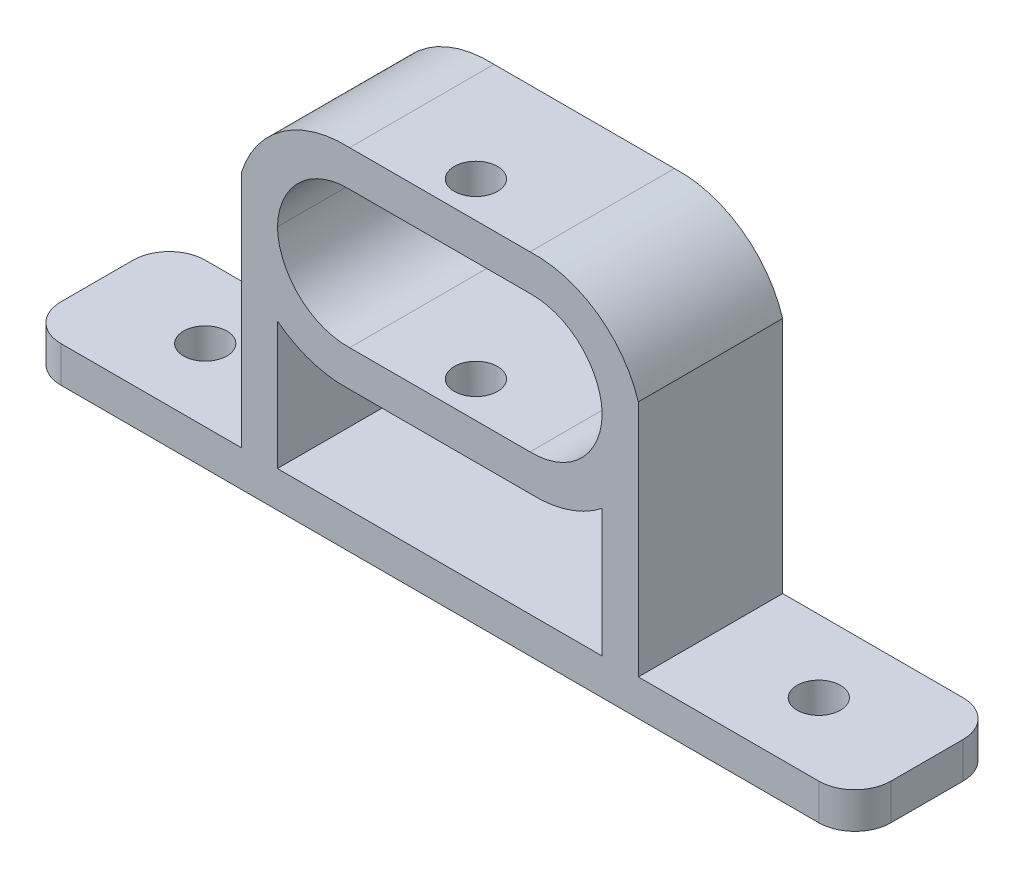
ISO-10303-21;
HEADER;
FILE_DESCRIPTION(('STEP AP214'),'2;1');
FILE_NAME('part.step','',(''),(''),'','','');
FILE_SCHEMA(('AUTOMOTIVE_DESIGN { 1 0 10303 214 1 1 1 1 }'));
ENDSEC;
DATA;
#1=APPLICATION_CONTEXT('core data for automotive mechanical design processes');
#2=APPLICATION_PROTOCOL_DEFINITION('international standard','automotive_design',2000,#1);
#3=PRODUCT_CONTEXT('',#1,'mechanical');
#4=PRODUCT('Part','Part','',(#3));
#5=PRODUCT_RELATED_PRODUCT_CATEGORY('part','',(#4));
#6=PRODUCT_DEFINITION_FORMATION('','',#4);
#7=PRODUCT_DEFINITION_CONTEXT('part definition',#1,'design');
#8=PRODUCT_DEFINITION('design','',#6,#7);
#9=PRODUCT_DEFINITION_SHAPE('','',#8);
#10=(LENGTH_UNIT() NAMED_UNIT(*) SI_UNIT(.MILLI.,.METRE.));
#11=(NAMED_UNIT(*) PLANE_ANGLE_UNIT() SI_UNIT($,.RADIAN.));
#12=(NAMED_UNIT(*) SI_UNIT($,.STERADIAN.) SOLID_ANGLE_UNIT());
#13=UNCERTAINTY_MEASURE_WITH_UNIT(LENGTH_MEASURE(1.E-05),#10,'distance_accuracy_value','');
#14=(GEOMETRIC_REPRESENTATION_CONTEXT(3) GLOBAL_UNCERTAINTY_ASSIGNED_CONTEXT((#13)) GLOBAL_UNIT_ASSIGNED_CONTEXT((#10,
#11,#12)) REPRESENTATION_CONTEXT('',''));
#15=CARTESIAN_POINT('',(0.,0.,0.));
#16=DIRECTION('',(0.,0.,1.));
#17=DIRECTION('',(1.,0.,0.));
#18=AXIS2_PLACEMENT_3D('',#15,#16,#17);
#19=CARTESIAN_POINT('',(-0.685985868036077,-5.7656940971944,20.));
#20=DIRECTION('',(0.,0.,-1.));
#21=DIRECTION('',(-1.,0.,0.));
#22=AXIS2_PLACEMENT_3D('',#19,#20,#21);
#23=PLANE('',#22);
#24=DIRECTION('',(0.,1.,0.));
#25=VECTOR('',#24,1.);
#26=CARTESIAN_POINT('',(-9.99999999999998,-35.25,20.));
#27=LINE('',#26,#25);
#28=CARTESIAN_POINT('',(-9.99999999999998,-35.25,20.));
#29=VERTEX_POINT('',#28);
#30=CARTESIAN_POINT('',(-10.,-17.5236335743977,20.));
#31=VERTEX_POINT('',#30);
#32=EDGE_CURVE('E328',#29,#31,#27,.T.);
#33=ORIENTED_EDGE('',*,*,#32,.T.);
#34=CARTESIAN_POINT('',(-0.685985868036077,-5.7656940971944,20.));
#35=DIRECTION('',(0.,0.,1.));
#36=DIRECTION('',(-1.,0.,0.));
#37=AXIS2_PLACEMENT_3D('',#34,#35,#36);
#38=CIRCLE('',#37,15.);
#39=CARTESIAN_POINT('',(0.,-20.75,20.));
#40=VERTEX_POINT('',#39);
#41=EDGE_CURVE('E257',#31,#40,#38,.T.);
#42=ORIENTED_EDGE('',*,*,#41,.T.);
#43=DIRECTION('',(1.,0.,0.));
#44=VECTOR('',#43,1.);
#45=CARTESIAN_POINT('',(0.,-20.75,20.));
#46=LINE('',#45,#44);
#47=CARTESIAN_POINT('',(25.,-20.75,20.));
#48=VERTEX_POINT('',#47);
#49=EDGE_CURVE('E399',#40,#48,#46,.T.);
#50=ORIENTED_EDGE('',*,*,#49,.T.);
#51=CARTESIAN_POINT('',(25.6859858680361,-5.7656940971944,20.));
#52=DIRECTION('',(0.,0.,1.));
#53=DIRECTION('',(1.,0.,0.));
#54=AXIS2_PLACEMENT_3D('',#51,#52,#53);
#55=CIRCLE('',#54,15.);
#56=CARTESIAN_POINT('',(35.,-17.5236335743977,20.));
#57=VERTEX_POINT('',#56);
#58=EDGE_CURVE('E401',#48,#57,#55,.T.);
#59=ORIENTED_EDGE('',*,*,#58,.T.);
#60=DIRECTION('',(0.,-1.,0.));
#61=VECTOR('',#60,1.);
#62=CARTESIAN_POINT('',(35.,-35.25,20.));
#63=LINE('',#62,#61);
#64=CARTESIAN_POINT('',(35.,-35.25,20.));
#65=VERTEX_POINT('',#64);
#66=EDGE_CURVE('E215',#57,#65,#63,.T.);
#67=ORIENTED_EDGE('',*,*,#66,.T.);
#68=DIRECTION('',(-1.,0.,0.));
#69=VECTOR('',#68,1.);
#70=CARTESIAN_POINT('',(-9.99999999999998,-35.25,20.));
#71=LINE('',#70,#69);
#72=EDGE_CURVE('E436',#65,#29,#71,.T.);
#73=ORIENTED_EDGE('',*,*,#72,.T.);
#74=EDGE_LOOP('',(#33,#42,#50,#59,#67,#73));
#75=FACE_BOUND('',#74,.T.);
#76=DIRECTION('',(1.,0.,0.));
#77=VECTOR('',#76,1.);
#78=CARTESIAN_POINT('',(40.,-40.25,20.));
#79=LINE('',#78,#77);
#80=CARTESIAN_POINT('',(-40.,-40.25,20.));
#81=VERTEX_POINT('',#80);
#82=CARTESIAN_POINT('',(65.,-40.25,20.));
#83=VERTEX_POINT('',#82);
#84=EDGE_CURVE('E315',#81,#83,#79,.T.);
#85=ORIENTED_EDGE('',*,*,#84,.T.);
#86=DIRECTION('',(0.,1.,0.));
#87=VECTOR('',#86,1.);
#88=CARTESIAN_POINT('',(65.,-35.25,20.));
#89=LINE('',#88,#87);
#90=CARTESIAN_POINT('',(65.,-35.25,20.));
#91=VERTEX_POINT('',#90);
#92=EDGE_CURVE('E11',#83,#91,#89,.T.);
#93=ORIENTED_EDGE('',*,*,#92,.T.);
#94=DIRECTION('',(-1.,0.,0.));
#95=VECTOR('',#94,1.);
#96=CARTESIAN_POINT('',(70.,-35.25,20.));
#97=LINE('',#96,#95);
#98=CARTESIAN_POINT('',(40.,-35.25,20.));
#99=VERTEX_POINT('',#98);
#100=EDGE_CURVE('E234',#91,#99,#97,.T.);
#101=ORIENTED_EDGE('',*,*,#100,.T.);
#102=DIRECTION('',(0.,1.,0.));
#103=VECTOR('',#102,1.);
#104=CARTESIAN_POINT('',(40.,-6.25,20.));
#105=LINE('',#104,#103);
#106=CARTESIAN_POINT('',(40.,-2.25,20.));
#107=VERTEX_POINT('',#106);
#108=EDGE_CURVE('E403',#99,#107,#105,.T.);
#109=ORIENTED_EDGE('',*,*,#108,.T.);
#110=CARTESIAN_POINT('',(25.6859858680361,-6.7343059028056,20.));
#111=DIRECTION('',(0.,0.,1.));
#112=DIRECTION('',(-1.,0.,0.));
#113=AXIS2_PLACEMENT_3D('',#110,#111,#112);
#114=CIRCLE('',#113,15.);
#115=CARTESIAN_POINT('',(25.,8.25,20.));
#116=VERTEX_POINT('',#115);
#117=EDGE_CURVE('E405',#107,#116,#114,.T.);
#118=ORIENTED_EDGE('',*,*,#117,.T.);
#119=DIRECTION('',(-1.,0.,0.));
#120=VECTOR('',#119,1.);
#121=CARTESIAN_POINT('',(0.,8.25,20.));
#122=LINE('',#121,#120);
#123=CARTESIAN_POINT('',(0.,8.25,20.));
#124=VERTEX_POINT('',#123);
#125=EDGE_CURVE('E407',#116,#124,#122,.T.);
#126=ORIENTED_EDGE('',*,*,#125,.T.);
#127=CARTESIAN_POINT('',(-0.685985868036077,-6.7343059028056,20.));
#128=DIRECTION('',(0.,0.,1.));
#129=DIRECTION('',(1.,0.,0.));
#130=AXIS2_PLACEMENT_3D('',#127,#128,#129);
#131=CIRCLE('',#130,15.);
#132=CARTESIAN_POINT('',(-15.,-2.25,20.));
#133=VERTEX_POINT('',#132);
#134=EDGE_CURVE('E409',#124,#133,#131,.T.);
#135=ORIENTED_EDGE('',*,*,#134,.T.);
#136=DIRECTION('',(0.,-1.,0.));
#137=VECTOR('',#136,1.);
#138=CARTESIAN_POINT('',(-15.,-6.25,20.));
#139=LINE('',#138,#137);
#140=CARTESIAN_POINT('',(-15.,-35.25,20.));
#141=VERTEX_POINT('',#140);
#142=EDGE_CURVE('E262',#133,#141,#139,.T.);
#143=ORIENTED_EDGE('',*,*,#142,.T.);
#144=DIRECTION('',(-1.,0.,0.));
#145=VECTOR('',#144,1.);
#146=CARTESIAN_POINT('',(-45.,-35.25,20.));
#147=LINE('',#146,#145);
#148=CARTESIAN_POINT('',(-40.,-35.25,20.));
#149=VERTEX_POINT('',#148);
#150=EDGE_CURVE('E317',#141,#149,#147,.T.);
#151=ORIENTED_EDGE('',*,*,#150,.T.);
#152=DIRECTION('',(0.,-1.,0.));
#153=VECTOR('',#152,1.);
#154=CARTESIAN_POINT('',(-40.,-40.25,20.));
#155=LINE('',#154,#153);
#156=EDGE_CURVE('E45',#149,#81,#155,.T.);
#157=ORIENTED_EDGE('',*,*,#156,.T.);
#158=EDGE_LOOP('',(#85,#93,#101,#109,#118,#126,#135,#143,#151,#157));
#159=FACE_BOUND('',#158,.T.);
#160=CARTESIAN_POINT('',(25.25,-6.50000000000001,20.));
#161=DIRECTION('',(0.,0.,1.));
#162=DIRECTION('',(-1.,0.,0.));
#163=AXIS2_PLACEMENT_3D('',#160,#161,#162);
#164=CIRCLE('',#163,9.75320460156559);
#165=CARTESIAN_POINT('',(35.,-6.25,20.));
#166=VERTEX_POINT('',#165);
#167=CARTESIAN_POINT('',(25.,3.25,20.));
#168=VERTEX_POINT('',#167);
#169=EDGE_CURVE('E354',#166,#168,#164,.T.);
#170=ORIENTED_EDGE('',*,*,#169,.F.);
#171=CARTESIAN_POINT('',(25.25,-6.,20.));
#172=DIRECTION('',(0.,0.,1.));
#173=DIRECTION('',(1.,0.,0.));
#174=AXIS2_PLACEMENT_3D('',#171,#172,#173);
#175=CIRCLE('',#174,9.75320460156559);
#176=CARTESIAN_POINT('',(25.,-15.75,20.));
#177=VERTEX_POINT('',#176);
#178=EDGE_CURVE('E366',#177,#166,#175,.T.);
#179=ORIENTED_EDGE('',*,*,#178,.F.);
#180=DIRECTION('',(1.,0.,0.));
#181=VECTOR('',#180,1.);
#182=CARTESIAN_POINT('',(0.,-15.75,20.));
#183=LINE('',#182,#181);
#184=CARTESIAN_POINT('',(0.,-15.75,20.));
#185=VERTEX_POINT('',#184);
#186=EDGE_CURVE('E363',#185,#177,#183,.T.);
#187=ORIENTED_EDGE('',*,*,#186,.F.);
#188=CARTESIAN_POINT('',(-0.249999999999997,-6.,20.));
#189=DIRECTION('',(0.,0.,1.));
#190=DIRECTION('',(-1.,0.,0.));
#191=AXIS2_PLACEMENT_3D('',#188,#189,#190);
#192=CIRCLE('',#191,9.75320460156558);
#193=CARTESIAN_POINT('',(-10.,-6.25,20.));
#194=VERTEX_POINT('',#193);
#195=EDGE_CURVE('E361',#194,#185,#192,.T.);
#196=ORIENTED_EDGE('',*,*,#195,.F.);
#197=CARTESIAN_POINT('',(-0.249999999999997,-6.50000000000001,20.));
#198=DIRECTION('',(0.,0.,1.));
#199=DIRECTION('',(1.,0.,0.));
#200=AXIS2_PLACEMENT_3D('',#197,#198,#199);
#201=CIRCLE('',#200,9.75320460156559);
#202=CARTESIAN_POINT('',(0.,3.25,20.));
#203=VERTEX_POINT('',#202);
#204=EDGE_CURVE('E359',#203,#194,#201,.T.);
#205=ORIENTED_EDGE('',*,*,#204,.F.);
#206=DIRECTION('',(-1.,0.,0.));
#207=VECTOR('',#206,1.);
#208=CARTESIAN_POINT('',(0.,3.25,20.));
#209=LINE('',#208,#207);
#210=EDGE_CURVE('E356',#168,#203,#209,.T.);
#211=ORIENTED_EDGE('',*,*,#210,.F.);
#212=EDGE_LOOP('',(#170,#179,#187,#196,#205,#211));
#213=FACE_BOUND('',#212,.T.);
#214=ADVANCED_FACE('F37',(#75,#159,#213),#23,.F.);
#215=CARTESIAN_POINT('',(-0.685985868036077,-5.7656940971944,0.));
#216=DIRECTION('',(0.,0.,-1.));
#217=DIRECTION('',(-1.,0.,0.));
#218=AXIS2_PLACEMENT_3D('',#215,#216,#217);
#219=PLANE('',#218);
#220=CARTESIAN_POINT('',(-0.685985868036077,-5.7656940971944,0.));
#221=DIRECTION('',(0.,0.,1.));
#222=DIRECTION('',(-1.,0.,0.));
#223=AXIS2_PLACEMENT_3D('',#220,#221,#222);
#224=CIRCLE('',#223,15.);
#225=CARTESIAN_POINT('',(-10.,-17.5236335743977,0.));
#226=VERTEX_POINT('',#225);
#227=CARTESIAN_POINT('',(0.,-20.75,0.));
#228=VERTEX_POINT('',#227);
#229=EDGE_CURVE('E245',#226,#228,#224,.T.);
#230=ORIENTED_EDGE('',*,*,#229,.F.);
#231=DIRECTION('',(0.,1.,0.));
#232=VECTOR('',#231,1.);
#233=CARTESIAN_POINT('',(-9.99999999999998,-35.25,0.));
#234=LINE('',#233,#232);
#235=CARTESIAN_POINT('',(-9.99999999999998,-35.25,0.));
#236=VERTEX_POINT('',#235);
#237=EDGE_CURVE('E424',#236,#226,#234,.T.);
#238=ORIENTED_EDGE('',*,*,#237,.F.);
#239=DIRECTION('',(-1.,0.,0.));
#240=VECTOR('',#239,1.);
#241=CARTESIAN_POINT('',(-9.99999999999998,-35.25,0.));
#242=LINE('',#241,#240);
#243=CARTESIAN_POINT('',(35.,-35.25,0.));
#244=VERTEX_POINT('',#243);
#245=EDGE_CURVE('E233',#244,#236,#242,.T.);
#246=ORIENTED_EDGE('',*,*,#245,.F.);
#247=DIRECTION('',(0.,-1.,0.));
#248=VECTOR('',#247,1.);
#249=CARTESIAN_POINT('',(35.,-35.25,0.));
#250=LINE('',#249,#248);
#251=CARTESIAN_POINT('',(35.,-17.5236335743977,0.));
#252=VERTEX_POINT('',#251);
#253=EDGE_CURVE('E213',#252,#244,#250,.T.);
#254=ORIENTED_EDGE('',*,*,#253,.F.);
#255=CARTESIAN_POINT('',(25.6859858680361,-5.7656940971944,0.));
#256=DIRECTION('',(0.,0.,1.));
#257=DIRECTION('',(1.,0.,0.));
#258=AXIS2_PLACEMENT_3D('',#255,#256,#257);
#259=CIRCLE('',#258,15.);
#260=CARTESIAN_POINT('',(25.,-20.75,0.));
#261=VERTEX_POINT('',#260);
#262=EDGE_CURVE('E230',#261,#252,#259,.T.);
#263=ORIENTED_EDGE('',*,*,#262,.F.);
#264=DIRECTION('',(1.,0.,0.));
#265=VECTOR('',#264,1.);
#266=CARTESIAN_POINT('',(0.,-20.75,0.));
#267=LINE('',#266,#265);
#268=EDGE_CURVE('E241',#228,#261,#267,.T.);
#269=ORIENTED_EDGE('',*,*,#268,.F.);
#270=EDGE_LOOP('',(#230,#238,#246,#254,#263,#269));
#271=FACE_BOUND('',#270,.T.);
#272=DIRECTION('',(1.,0.,0.));
#273=VECTOR('',#272,1.);
#274=CARTESIAN_POINT('',(-15.,-40.25,0.));
#275=LINE('',#274,#273);
#276=CARTESIAN_POINT('',(-40.,-40.25,0.));
#277=VERTEX_POINT('',#276);
#278=CARTESIAN_POINT('',(65.,-40.25,0.));
#279=VERTEX_POINT('',#278);
#280=EDGE_CURVE('E428',#277,#279,#275,.T.);
#281=ORIENTED_EDGE('',*,*,#280,.F.);
#282=DIRECTION('',(0.,-1.,0.));
#283=VECTOR('',#282,1.);
#284=CARTESIAN_POINT('',(-40.,-5.7656940971944,0.));
#285=LINE('',#284,#283);
#286=CARTESIAN_POINT('',(-40.,-35.25,0.));
#287=VERTEX_POINT('',#286);
#288=EDGE_CURVE('E295',#277,#287,#285,.F.);
#289=ORIENTED_EDGE('',*,*,#288,.T.);
#290=DIRECTION('',(-1.,0.,0.));
#291=VECTOR('',#290,1.);
#292=CARTESIAN_POINT('',(-45.,-35.25,0.));
#293=LINE('',#292,#291);
#294=CARTESIAN_POINT('',(-15.,-35.25,0.));
#295=VERTEX_POINT('',#294);
#296=EDGE_CURVE('E425',#295,#287,#293,.T.);
#297=ORIENTED_EDGE('',*,*,#296,.F.);
#298=DIRECTION('',(0.,-1.,0.));
#299=VECTOR('',#298,1.);
#300=CARTESIAN_POINT('',(-15.,-6.25,0.));
#301=LINE('',#300,#299);
#302=CARTESIAN_POINT('',(-15.,-2.25,0.));
#303=VERTEX_POINT('',#302);
#304=EDGE_CURVE('E255',#303,#295,#301,.T.);
#305=ORIENTED_EDGE('',*,*,#304,.F.);
#306=CARTESIAN_POINT('',(-0.685985868036077,-6.7343059028056,0.));
#307=DIRECTION('',(0.,0.,1.));
#308=DIRECTION('',(1.,0.,0.));
#309=AXIS2_PLACEMENT_3D('',#306,#307,#308);
#310=CIRCLE('',#309,15.);
#311=CARTESIAN_POINT('',(0.,8.25,0.));
#312=VERTEX_POINT('',#311);
#313=EDGE_CURVE('E252',#312,#303,#310,.T.);
#314=ORIENTED_EDGE('',*,*,#313,.F.);
#315=DIRECTION('',(-1.,0.,0.));
#316=VECTOR('',#315,1.);
#317=CARTESIAN_POINT('',(0.,8.25,0.));
#318=LINE('',#317,#316);
#319=CARTESIAN_POINT('',(25.,8.25,0.));
#320=VERTEX_POINT('',#319);
#321=EDGE_CURVE('E250',#320,#312,#318,.T.);
#322=ORIENTED_EDGE('',*,*,#321,.F.);
#323=CARTESIAN_POINT('',(25.6859858680361,-6.7343059028056,0.));
#324=DIRECTION('',(0.,0.,1.));
#325=DIRECTION('',(-1.,0.,0.));
#326=AXIS2_PLACEMENT_3D('',#323,#324,#325);
#327=CIRCLE('',#326,15.);
#328=CARTESIAN_POINT('',(40.,-2.25,0.));
#329=VERTEX_POINT('',#328);
#330=EDGE_CURVE('E243',#329,#320,#327,.T.);
#331=ORIENTED_EDGE('',*,*,#330,.F.);
#332=DIRECTION('',(0.,1.,0.));
#333=VECTOR('',#332,1.);
#334=CARTESIAN_POINT('',(40.,-6.25,0.));
#335=LINE('',#334,#333);
#336=CARTESIAN_POINT('',(40.,-35.25,0.));
#337=VERTEX_POINT('',#336);
#338=EDGE_CURVE('E240',#337,#329,#335,.T.);
#339=ORIENTED_EDGE('',*,*,#338,.F.);
#340=DIRECTION('',(-1.,0.,0.));
#341=VECTOR('',#340,1.);
#342=CARTESIAN_POINT('',(70.,-35.25,0.));
#343=LINE('',#342,#341);
#344=CARTESIAN_POINT('',(65.,-35.25,0.));
#345=VERTEX_POINT('',#344);
#346=EDGE_CURVE('E221',#345,#337,#343,.T.);
#347=ORIENTED_EDGE('',*,*,#346,.F.);
#348=DIRECTION('',(0.,1.,0.));
#349=VECTOR('',#348,1.);
#350=CARTESIAN_POINT('',(65.,-5.7656940971944,0.));
#351=LINE('',#350,#349);
#352=EDGE_CURVE('E293',#345,#279,#351,.F.);
#353=ORIENTED_EDGE('',*,*,#352,.T.);
#354=EDGE_LOOP('',(#281,#289,#297,#305,#314,#322,#331,#339,#347,#353));
#355=FACE_BOUND('',#354,.T.);
#356=CARTESIAN_POINT('',(25.25,-6.,0.));
#357=DIRECTION('',(0.,0.,1.));
#358=DIRECTION('',(1.,0.,0.));
#359=AXIS2_PLACEMENT_3D('',#356,#357,#358);
#360=CIRCLE('',#359,9.75320460156559);
#361=CARTESIAN_POINT('',(25.,-15.75,0.));
#362=VERTEX_POINT('',#361);
#363=CARTESIAN_POINT('',(35.,-6.25,0.));
#364=VERTEX_POINT('',#363);
#365=EDGE_CURVE('E357',#362,#364,#360,.T.);
#366=ORIENTED_EDGE('',*,*,#365,.T.);
#367=CARTESIAN_POINT('',(25.25,-6.50000000000001,0.));
#368=DIRECTION('',(0.,0.,1.));
#369=DIRECTION('',(-1.,0.,0.));
#370=AXIS2_PLACEMENT_3D('',#367,#368,#369);
#371=CIRCLE('',#370,9.75320460156559);
#372=CARTESIAN_POINT('',(25.,3.25,0.));
#373=VERTEX_POINT('',#372);
#374=EDGE_CURVE('E335',#364,#373,#371,.T.);
#375=ORIENTED_EDGE('',*,*,#374,.T.);
#376=DIRECTION('',(-1.,0.,0.));
#377=VECTOR('',#376,1.);
#378=CARTESIAN_POINT('',(0.,3.25,0.));
#379=LINE('',#378,#377);
#380=CARTESIAN_POINT('',(0.,3.25,0.));
#381=VERTEX_POINT('',#380);
#382=EDGE_CURVE('E371',#373,#381,#379,.T.);
#383=ORIENTED_EDGE('',*,*,#382,.T.);
#384=CARTESIAN_POINT('',(-0.249999999999997,-6.50000000000001,0.));
#385=DIRECTION('',(0.,0.,1.));
#386=DIRECTION('',(1.,0.,0.));
#387=AXIS2_PLACEMENT_3D('',#384,#385,#386);
#388=CIRCLE('',#387,9.75320460156559);
#389=CARTESIAN_POINT('',(-10.,-6.25,0.));
#390=VERTEX_POINT('',#389);
#391=EDGE_CURVE('E374',#381,#390,#388,.T.);
#392=ORIENTED_EDGE('',*,*,#391,.T.);
#393=CARTESIAN_POINT('',(-0.249999999999997,-6.,0.));
#394=DIRECTION('',(0.,0.,1.));
#395=DIRECTION('',(-1.,0.,0.));
#396=AXIS2_PLACEMENT_3D('',#393,#394,#395);
#397=CIRCLE('',#396,9.75320460156558);
#398=CARTESIAN_POINT('',(0.,-15.75,0.));
#399=VERTEX_POINT('',#398);
#400=EDGE_CURVE('E377',#390,#399,#397,.T.);
#401=ORIENTED_EDGE('',*,*,#400,.T.);
#402=DIRECTION('',(1.,0.,0.));
#403=VECTOR('',#402,1.);
#404=CARTESIAN_POINT('',(0.,-15.75,0.));
#405=LINE('',#404,#403);
#406=EDGE_CURVE('E380',#399,#362,#405,.T.);
#407=ORIENTED_EDGE('',*,*,#406,.T.);
#408=EDGE_LOOP('',(#366,#375,#383,#392,#401,#407));
#409=FACE_BOUND('',#408,.T.);
#410=ADVANCED_FACE('F227',(#271,#355,#409),#219,.T.);
#411=CARTESIAN_POINT('',(-0.685985868036077,-5.7656940971944,20.));
#412=DIRECTION('',(0.,0.,-1.));
#413=DIRECTION('',(-1.,0.,0.));
#414=AXIS2_PLACEMENT_3D('',#411,#412,#413);
#415=CYLINDRICAL_SURFACE('',#414,15.);
#416=ORIENTED_EDGE('',*,*,#41,.F.);
#417=DIRECTION('',(0.,0.,1.));
#418=VECTOR('',#417,1.);
#419=CARTESIAN_POINT('',(-10.,-17.5236335743977,0.));
#420=LINE('',#419,#418);
#421=EDGE_CURVE('E348',#226,#31,#420,.T.);
#422=ORIENTED_EDGE('',*,*,#421,.F.);
#423=ORIENTED_EDGE('',*,*,#229,.T.);
#424=DIRECTION('',(0.,0.,-1.));
#425=VECTOR('',#424,1.);
#426=CARTESIAN_POINT('',(0.,-20.75,20.));
#427=LINE('',#426,#425);
#428=EDGE_CURVE('E272',#40,#228,#427,.T.);
#429=ORIENTED_EDGE('',*,*,#428,.F.);
#430=EDGE_LOOP('',(#416,#422,#423,#429));
#431=FACE_BOUND('',#430,.T.);
#432=ADVANCED_FACE('F413',(#431),#415,.T.);
#433=CARTESIAN_POINT('',(0.,-20.75,20.));
#434=DIRECTION('',(0.,1.,0.));
#435=DIRECTION('',(0.,0.,1.));
#436=AXIS2_PLACEMENT_3D('',#433,#434,#435);
#437=PLANE('',#436);
#438=CARTESIAN_POINT('',(12.5,-20.75,15.));
#439=DIRECTION('',(0.,1.,0.));
#440=DIRECTION('',(0.,0.,1.));
#441=AXIS2_PLACEMENT_3D('',#438,#439,#440);
#442=CIRCLE('',#441,3.);
#443=CARTESIAN_POINT('',(12.5,-20.75,18.));
#444=VERTEX_POINT('',#443);
#445=EDGE_CURVE('E280',#444,#444,#442,.F.);
#446=ORIENTED_EDGE('',*,*,#445,.F.);
#447=EDGE_LOOP('',(#446));
#448=FACE_BOUND('',#447,.T.);
#449=ORIENTED_EDGE('',*,*,#268,.T.);
#450=DIRECTION('',(0.,0.,-1.));
#451=VECTOR('',#450,1.);
#452=CARTESIAN_POINT('',(25.,-20.75,20.));
#453=LINE('',#452,#451);
#454=EDGE_CURVE('E239',#48,#261,#453,.T.);
#455=ORIENTED_EDGE('',*,*,#454,.F.);
#456=ORIENTED_EDGE('',*,*,#49,.F.);
#457=ORIENTED_EDGE('',*,*,#428,.T.);
#458=EDGE_LOOP('',(#449,#455,#456,#457));
#459=FACE_BOUND('',#458,.T.);
#460=ADVANCED_FACE('F417',(#448,#459),#437,.F.);
#461=CARTESIAN_POINT('',(25.6859858680361,-5.7656940971944,20.));
#462=DIRECTION('',(0.,0.,-1.));
#463=DIRECTION('',(-1.,0.,0.));
#464=AXIS2_PLACEMENT_3D('',#461,#462,#463);
#465=CYLINDRICAL_SURFACE('',#464,15.);
#466=ORIENTED_EDGE('',*,*,#262,.T.);
#467=DIRECTION('',(0.,0.,1.));
#468=VECTOR('',#467,1.);
#469=CARTESIAN_POINT('',(35.,-17.5236335743977,0.));
#470=LINE('',#469,#468);
#471=EDGE_CURVE('E210',#252,#57,#470,.T.);
#472=ORIENTED_EDGE('',*,*,#471,.T.);
#473=ORIENTED_EDGE('',*,*,#58,.F.);
#474=ORIENTED_EDGE('',*,*,#454,.T.);
#475=EDGE_LOOP('',(#466,#472,#473,#474));
#476=FACE_BOUND('',#475,.T.);
#477=ADVANCED_FACE('F237',(#476),#465,.T.);
#478=CARTESIAN_POINT('',(40.,-6.25,20.));
#479=DIRECTION('',(-1.,0.,0.));
#480=DIRECTION('',(0.,0.,1.));
#481=AXIS2_PLACEMENT_3D('',#478,#479,#480);
#482=PLANE('',#481);
#483=ORIENTED_EDGE('',*,*,#338,.T.);
#484=DIRECTION('',(0.,0.,-1.));
#485=VECTOR('',#484,1.);
#486=CARTESIAN_POINT('',(40.,-2.25,20.));
#487=LINE('',#486,#485);
#488=EDGE_CURVE('E268',#107,#329,#487,.T.);
#489=ORIENTED_EDGE('',*,*,#488,.F.);
#490=ORIENTED_EDGE('',*,*,#108,.F.);
#491=DIRECTION('',(0.,0.,1.));
#492=VECTOR('',#491,1.);
#493=CARTESIAN_POINT('',(40.,-35.25,0.));
#494=LINE('',#493,#492);
#495=EDGE_CURVE('E332',#337,#99,#494,.T.);
#496=ORIENTED_EDGE('',*,*,#495,.F.);
#497=EDGE_LOOP('',(#483,#489,#490,#496));
#498=FACE_BOUND('',#497,.T.);
#499=ADVANCED_FACE('F475',(#498),#482,.F.);
#500=CARTESIAN_POINT('',(25.6859858680361,-6.7343059028056,20.));
#501=DIRECTION('',(0.,0.,-1.));
#502=DIRECTION('',(-1.,0.,0.));
#503=AXIS2_PLACEMENT_3D('',#500,#501,#502);
#504=CYLINDRICAL_SURFACE('',#503,15.);
#505=ORIENTED_EDGE('',*,*,#330,.T.);
#506=DIRECTION('',(0.,0.,-1.));
#507=VECTOR('',#506,1.);
#508=CARTESIAN_POINT('',(25.,8.25,20.));
#509=LINE('',#508,#507);
#510=EDGE_CURVE('E265',#116,#320,#509,.T.);
#511=ORIENTED_EDGE('',*,*,#510,.F.);
#512=ORIENTED_EDGE('',*,*,#117,.F.);
#513=ORIENTED_EDGE('',*,*,#488,.T.);
#514=EDGE_LOOP('',(#505,#511,#512,#513));
#515=FACE_BOUND('',#514,.T.);
#516=ADVANCED_FACE('F471',(#515),#504,.T.);
#517=CARTESIAN_POINT('',(0.,8.25,20.));
#518=DIRECTION('',(0.,-1.,0.));
#519=DIRECTION('',(0.,0.,-1.));
#520=AXIS2_PLACEMENT_3D('',#517,#518,#519);
#521=PLANE('',#520);
#522=CARTESIAN_POINT('',(12.5,8.25,15.));
#523=DIRECTION('',(0.,1.,0.));
#524=DIRECTION('',(0.,0.,1.));
#525=AXIS2_PLACEMENT_3D('',#522,#523,#524);
#526=CIRCLE('',#525,3.);
#527=CARTESIAN_POINT('',(12.5,8.25,18.));
#528=VERTEX_POINT('',#527);
#529=EDGE_CURVE('E559',#528,#528,#526,.T.);
#530=ORIENTED_EDGE('',*,*,#529,.F.);
#531=EDGE_LOOP('',(#530));
#532=FACE_BOUND('',#531,.T.);
#533=ORIENTED_EDGE('',*,*,#321,.T.);
#534=DIRECTION('',(0.,0.,-1.));
#535=VECTOR('',#534,1.);
#536=CARTESIAN_POINT('',(0.,8.25,20.));
#537=LINE('',#536,#535);
#538=EDGE_CURVE('E261',#124,#312,#537,.T.);
#539=ORIENTED_EDGE('',*,*,#538,.F.);
#540=ORIENTED_EDGE('',*,*,#125,.F.);
#541=ORIENTED_EDGE('',*,*,#510,.T.);
#542=EDGE_LOOP('',(#533,#539,#540,#541));
#543=FACE_BOUND('',#542,.T.);
#544=ADVANCED_FACE('F467',(#532,#543),#521,.F.);
#545=CARTESIAN_POINT('',(-0.685985868036077,-6.7343059028056,20.));
#546=DIRECTION('',(0.,0.,-1.));
#547=DIRECTION('',(-1.,0.,0.));
#548=AXIS2_PLACEMENT_3D('',#545,#546,#547);
#549=CYLINDRICAL_SURFACE('',#548,15.);
#550=ORIENTED_EDGE('',*,*,#313,.T.);
#551=DIRECTION('',(0.,0.,-1.));
#552=VECTOR('',#551,1.);
#553=CARTESIAN_POINT('',(-15.,-2.25,20.));
#554=LINE('',#553,#552);
#555=EDGE_CURVE('E258',#133,#303,#554,.T.);
#556=ORIENTED_EDGE('',*,*,#555,.F.);
#557=ORIENTED_EDGE('',*,*,#134,.F.);
#558=ORIENTED_EDGE('',*,*,#538,.T.);
#559=EDGE_LOOP('',(#550,#556,#557,#558));
#560=FACE_BOUND('',#559,.T.);
#561=ADVANCED_FACE('F463',(#560),#549,.T.);
#562=CARTESIAN_POINT('',(-15.,-6.25,20.));
#563=DIRECTION('',(1.,0.,0.));
#564=DIRECTION('',(0.,1.,0.));
#565=AXIS2_PLACEMENT_3D('',#562,#563,#564);
#566=PLANE('',#565);
#567=ORIENTED_EDGE('',*,*,#304,.T.);
#568=DIRECTION('',(0.,0.,1.));
#569=VECTOR('',#568,1.);
#570=CARTESIAN_POINT('',(-15.,-35.25,0.));
#571=LINE('',#570,#569);
#572=EDGE_CURVE('E345',#295,#141,#571,.T.);
#573=ORIENTED_EDGE('',*,*,#572,.T.);
#574=ORIENTED_EDGE('',*,*,#142,.F.);
#575=ORIENTED_EDGE('',*,*,#555,.T.);
#576=EDGE_LOOP('',(#567,#573,#574,#575));
#577=FACE_BOUND('',#576,.T.);
#578=ADVANCED_FACE('F460',(#577),#566,.F.);
#579=CARTESIAN_POINT('',(25.25,-6.50000000000001,20.));
#580=DIRECTION('',(0.,0.,-1.));
#581=DIRECTION('',(-1.,0.,0.));
#582=AXIS2_PLACEMENT_3D('',#579,#580,#581);
#583=CYLINDRICAL_SURFACE('',#582,9.75320460156559);
#584=ORIENTED_EDGE('',*,*,#374,.F.);
#585=DIRECTION('',(0.,0.,-1.));
#586=VECTOR('',#585,1.);
#587=CARTESIAN_POINT('',(35.,-6.25,20.));
#588=LINE('',#587,#586);
#589=EDGE_CURVE('E368',#166,#364,#588,.T.);
#590=ORIENTED_EDGE('',*,*,#589,.F.);
#591=ORIENTED_EDGE('',*,*,#169,.T.);
#592=DIRECTION('',(0.,0.,-1.));
#593=VECTOR('',#592,1.);
#594=CARTESIAN_POINT('',(25.,3.25,20.));
#595=LINE('',#594,#593);
#596=EDGE_CURVE('E395',#168,#373,#595,.T.);
#597=ORIENTED_EDGE('',*,*,#596,.T.);
#598=EDGE_LOOP('',(#584,#590,#591,#597));
#599=FACE_BOUND('',#598,.T.);
#600=ADVANCED_FACE('F457',(#599),#583,.F.);
#601=CARTESIAN_POINT('',(0.,3.25,20.));
#602=DIRECTION('',(0.,-1.,0.));
#603=DIRECTION('',(0.,0.,-1.));
#604=AXIS2_PLACEMENT_3D('',#601,#602,#603);
#605=PLANE('',#604);
#606=CARTESIAN_POINT('',(12.5,3.25,15.));
#607=DIRECTION('',(0.,-1.,0.));
#608=DIRECTION('',(0.,0.,-1.));
#609=AXIS2_PLACEMENT_3D('',#606,#607,#608);
#610=CIRCLE('',#609,3.);
#611=CARTESIAN_POINT('',(12.5,3.25,12.));
#612=VERTEX_POINT('',#611);
#613=EDGE_CURVE('E279',#612,#612,#610,.T.);
#614=ORIENTED_EDGE('',*,*,#613,.F.);
#615=EDGE_LOOP('',(#614));
#616=FACE_BOUND('',#615,.T.);
#617=ORIENTED_EDGE('',*,*,#382,.F.);
#618=ORIENTED_EDGE('',*,*,#596,.F.);
#619=ORIENTED_EDGE('',*,*,#210,.T.);
#620=DIRECTION('',(0.,0.,-1.));
#621=VECTOR('',#620,1.);
#622=CARTESIAN_POINT('',(0.,3.25,20.));
#623=LINE('',#622,#621);
#624=EDGE_CURVE('E393',#203,#381,#623,.T.);
#625=ORIENTED_EDGE('',*,*,#624,.T.);
#626=EDGE_LOOP('',(#617,#618,#619,#625));
#627=FACE_BOUND('',#626,.T.);
#628=ADVANCED_FACE('F578',(#616,#627),#605,.T.);
#629=CARTESIAN_POINT('',(-0.249999999999997,-6.50000000000001,20.));
#630=DIRECTION('',(0.,0.,-1.));
#631=DIRECTION('',(-1.,0.,0.));
#632=AXIS2_PLACEMENT_3D('',#629,#630,#631);
#633=CYLINDRICAL_SURFACE('',#632,9.75320460156559);
#634=ORIENTED_EDGE('',*,*,#391,.F.);
#635=ORIENTED_EDGE('',*,*,#624,.F.);
#636=ORIENTED_EDGE('',*,*,#204,.T.);
#637=DIRECTION('',(0.,0.,-1.));
#638=VECTOR('',#637,1.);
#639=CARTESIAN_POINT('',(-10.,-6.25,20.));
#640=LINE('',#639,#638);
#641=EDGE_CURVE('E391',#194,#390,#640,.T.);
#642=ORIENTED_EDGE('',*,*,#641,.T.);
#643=EDGE_LOOP('',(#634,#635,#636,#642));
#644=FACE_BOUND('',#643,.T.);
#645=ADVANCED_FACE('F581',(#644),#633,.F.);
#646=CARTESIAN_POINT('',(-0.249999999999997,-6.,20.));
#647=DIRECTION('',(0.,0.,-1.));
#648=DIRECTION('',(-1.,0.,0.));
#649=AXIS2_PLACEMENT_3D('',#646,#647,#648);
#650=CYLINDRICAL_SURFACE('',#649,9.75320460156558);
#651=ORIENTED_EDGE('',*,*,#400,.F.);
#652=ORIENTED_EDGE('',*,*,#641,.F.);
#653=ORIENTED_EDGE('',*,*,#195,.T.);
#654=DIRECTION('',(0.,0.,-1.));
#655=VECTOR('',#654,1.);
#656=CARTESIAN_POINT('',(0.,-15.75,20.));
#657=LINE('',#656,#655);
#658=EDGE_CURVE('E389',#185,#399,#657,.T.);
#659=ORIENTED_EDGE('',*,*,#658,.T.);
#660=EDGE_LOOP('',(#651,#652,#653,#659));
#661=FACE_BOUND('',#660,.T.);
#662=ADVANCED_FACE('F600',(#661),#650,.F.);
#663=CARTESIAN_POINT('',(0.,-15.75,20.));
#664=DIRECTION('',(0.,1.,0.));
#665=DIRECTION('',(-1.,0.,0.));
#666=AXIS2_PLACEMENT_3D('',#663,#664,#665);
#667=PLANE('',#666);
#668=CARTESIAN_POINT('',(12.5,-15.75,15.));
#669=DIRECTION('',(0.,1.,0.));
#670=DIRECTION('',(-1.,0.,0.));
#671=AXIS2_PLACEMENT_3D('',#668,#669,#670);
#672=CIRCLE('',#671,3.);
#673=CARTESIAN_POINT('',(9.5,-15.75,15.));
#674=VERTEX_POINT('',#673);
#675=EDGE_CURVE('E276',#674,#674,#672,.T.);
#676=ORIENTED_EDGE('',*,*,#675,.F.);
#677=EDGE_LOOP('',(#676));
#678=FACE_BOUND('',#677,.T.);
#679=ORIENTED_EDGE('',*,*,#406,.F.);
#680=ORIENTED_EDGE('',*,*,#658,.F.);
#681=ORIENTED_EDGE('',*,*,#186,.T.);
#682=DIRECTION('',(0.,0.,-1.));
#683=VECTOR('',#682,1.);
#684=CARTESIAN_POINT('',(25.,-15.75,20.));
#685=LINE('',#684,#683);
#686=EDGE_CURVE('E387',#177,#362,#685,.T.);
#687=ORIENTED_EDGE('',*,*,#686,.T.);
#688=EDGE_LOOP('',(#679,#680,#681,#687));
#689=FACE_BOUND('',#688,.T.);
#690=ADVANCED_FACE('F603',(#678,#689),#667,.T.);
#691=CARTESIAN_POINT('',(25.25,-6.,20.));
#692=DIRECTION('',(0.,0.,-1.));
#693=DIRECTION('',(-1.,0.,0.));
#694=AXIS2_PLACEMENT_3D('',#691,#692,#693);
#695=CYLINDRICAL_SURFACE('',#694,9.75320460156559);
#696=ORIENTED_EDGE('',*,*,#365,.F.);
#697=ORIENTED_EDGE('',*,*,#686,.F.);
#698=ORIENTED_EDGE('',*,*,#178,.T.);
#699=ORIENTED_EDGE('',*,*,#589,.T.);
#700=EDGE_LOOP('',(#696,#697,#698,#699));
#701=FACE_BOUND('',#700,.T.);
#702=ADVANCED_FACE('F544',(#701),#695,.F.);
#703=CARTESIAN_POINT('',(70.,-35.25,0.));
#704=DIRECTION('',(0.,1.,0.));
#705=DIRECTION('',(-1.,0.,0.));
#706=AXIS2_PLACEMENT_3D('',#703,#704,#705);
#707=PLANE('',#706);
#708=CARTESIAN_POINT('',(55.,-35.25,10.));
#709=DIRECTION('',(0.,1.,0.));
#710=DIRECTION('',(1.,0.,0.));
#711=AXIS2_PLACEMENT_3D('',#708,#709,#710);
#712=CIRCLE('',#711,3.);
#713=CARTESIAN_POINT('',(58.,-35.25,10.));
#714=VERTEX_POINT('',#713);
#715=EDGE_CURVE('E565',#714,#714,#712,.T.);
#716=ORIENTED_EDGE('',*,*,#715,.F.);
#717=EDGE_LOOP('',(#716));
#718=FACE_BOUND('',#717,.T.);
#719=DIRECTION('',(0.,0.,1.));
#720=VECTOR('',#719,1.);
#721=CARTESIAN_POINT('',(70.,-35.25,0.));
#722=LINE('',#721,#720);
#723=CARTESIAN_POINT('',(70.,-35.25,5.));
#724=VERTEX_POINT('',#723);
#725=CARTESIAN_POINT('',(70.,-35.25,15.));
#726=VERTEX_POINT('',#725);
#727=EDGE_CURVE('E336',#724,#726,#722,.T.);
#728=ORIENTED_EDGE('',*,*,#727,.F.);
#729=CARTESIAN_POINT('',(65.,-35.25,5.));
#730=DIRECTION('',(0.,1.,0.));
#731=DIRECTION('',(-1.,0.,0.));
#732=AXIS2_PLACEMENT_3D('',#729,#730,#731);
#733=CIRCLE('',#732,5.);
#734=EDGE_CURVE('E307',#724,#345,#733,.T.);
#735=ORIENTED_EDGE('',*,*,#734,.T.);
#736=ORIENTED_EDGE('',*,*,#346,.T.);
#737=ORIENTED_EDGE('',*,*,#495,.T.);
#738=ORIENTED_EDGE('',*,*,#100,.F.);
#739=CARTESIAN_POINT('',(65.,-35.25,15.));
#740=DIRECTION('',(0.,1.,0.));
#741=DIRECTION('',(-1.,0.,0.));
#742=AXIS2_PLACEMENT_3D('',#739,#740,#741);
#743=CIRCLE('',#742,5.);
#744=EDGE_CURVE('E52',#91,#726,#743,.T.);
#745=ORIENTED_EDGE('',*,*,#744,.T.);
#746=EDGE_LOOP('',(#728,#735,#736,#737,#738,#745));
#747=FACE_BOUND('',#746,.T.);
#748=ADVANCED_FACE('F502',(#718,#747),#707,.T.);
#749=CARTESIAN_POINT('',(70.,-40.25,0.));
#750=DIRECTION('',(1.,0.,0.));
#751=DIRECTION('',(0.,0.,-1.));
#752=AXIS2_PLACEMENT_3D('',#749,#750,#751);
#753=PLANE('',#752);
#754=DIRECTION('',(0.,0.,1.));
#755=VECTOR('',#754,1.);
#756=CARTESIAN_POINT('',(70.,-40.25,0.));
#757=LINE('',#756,#755);
#758=CARTESIAN_POINT('',(70.,-40.25,5.));
#759=VERTEX_POINT('',#758);
#760=CARTESIAN_POINT('',(70.,-40.25,15.));
#761=VERTEX_POINT('',#760);
#762=EDGE_CURVE('E338',#759,#761,#757,.T.);
#763=ORIENTED_EDGE('',*,*,#762,.F.);
#764=DIRECTION('',(0.,1.,0.));
#765=VECTOR('',#764,1.);
#766=CARTESIAN_POINT('',(70.,-40.25,5.));
#767=LINE('',#766,#765);
#768=EDGE_CURVE('E303',#759,#724,#767,.T.);
#769=ORIENTED_EDGE('',*,*,#768,.T.);
#770=ORIENTED_EDGE('',*,*,#727,.T.);
#771=DIRECTION('',(0.,1.,0.));
#772=VECTOR('',#771,1.);
#773=CARTESIAN_POINT('',(70.,-40.25,15.));
#774=LINE('',#773,#772);
#775=EDGE_CURVE('E301',#726,#761,#774,.F.);
#776=ORIENTED_EDGE('',*,*,#775,.T.);
#777=EDGE_LOOP('',(#763,#769,#770,#776));
#778=FACE_BOUND('',#777,.T.);
#779=ADVANCED_FACE('F535',(#778),#753,.T.);
#780=CARTESIAN_POINT('',(40.,-40.25,0.));
#781=DIRECTION('',(0.,-1.,0.));
#782=DIRECTION('',(0.,0.,-1.));
#783=AXIS2_PLACEMENT_3D('',#780,#781,#782);
#784=PLANE('',#783);
#785=CARTESIAN_POINT('',(55.,-40.25,10.));
#786=DIRECTION('',(0.,-1.,0.));
#787=DIRECTION('',(0.,0.,-1.));
#788=AXIS2_PLACEMENT_3D('',#785,#786,#787);
#789=CIRCLE('',#788,3.);
#790=CARTESIAN_POINT('',(55.,-40.25,7.));
#791=VERTEX_POINT('',#790);
#792=EDGE_CURVE('E568',#791,#791,#789,.F.);
#793=ORIENTED_EDGE('',*,*,#792,.T.);
#794=EDGE_LOOP('',(#793));
#795=FACE_BOUND('',#794,.T.);
#796=CARTESIAN_POINT('',(-30.,-40.25,10.));
#797=DIRECTION('',(0.,-1.,0.));
#798=DIRECTION('',(0.,0.,-1.));
#799=AXIS2_PLACEMENT_3D('',#796,#797,#798);
#800=CIRCLE('',#799,3.);
#801=CARTESIAN_POINT('',(-30.,-40.25,7.));
#802=VERTEX_POINT('',#801);
#803=EDGE_CURVE('E560',#802,#802,#800,.F.);
#804=ORIENTED_EDGE('',*,*,#803,.T.);
#805=EDGE_LOOP('',(#804));
#806=FACE_BOUND('',#805,.T.);
#807=DIRECTION('',(0.,0.,1.));
#808=VECTOR('',#807,1.);
#809=CARTESIAN_POINT('',(-45.,-40.25,0.));
#810=LINE('',#809,#808);
#811=CARTESIAN_POINT('',(-45.,-40.25,5.));
#812=VERTEX_POINT('',#811);
#813=CARTESIAN_POINT('',(-45.,-40.25,15.));
#814=VERTEX_POINT('',#813);
#815=EDGE_CURVE('E340',#812,#814,#810,.T.);
#816=ORIENTED_EDGE('',*,*,#815,.F.);
#817=CARTESIAN_POINT('',(-40.,-40.25,5.));
#818=DIRECTION('',(0.,-1.,0.));
#819=DIRECTION('',(0.,0.,-1.));
#820=AXIS2_PLACEMENT_3D('',#817,#818,#819);
#821=CIRCLE('',#820,5.);
#822=EDGE_CURVE('E291',#812,#277,#821,.T.);
#823=ORIENTED_EDGE('',*,*,#822,.T.);
#824=ORIENTED_EDGE('',*,*,#280,.T.);
#825=CARTESIAN_POINT('',(65.,-40.25,5.));
#826=DIRECTION('',(0.,-1.,0.));
#827=DIRECTION('',(0.,0.,-1.));
#828=AXIS2_PLACEMENT_3D('',#825,#826,#827);
#829=CIRCLE('',#828,5.);
#830=EDGE_CURVE('E289',#279,#759,#829,.T.);
#831=ORIENTED_EDGE('',*,*,#830,.T.);
#832=ORIENTED_EDGE('',*,*,#762,.T.);
#833=CARTESIAN_POINT('',(65.,-40.25,15.));
#834=DIRECTION('',(0.,-1.,0.));
#835=DIRECTION('',(0.,0.,-1.));
#836=AXIS2_PLACEMENT_3D('',#833,#834,#835);
#837=CIRCLE('',#836,5.);
#838=EDGE_CURVE('E287',#761,#83,#837,.T.);
#839=ORIENTED_EDGE('',*,*,#838,.T.);
#840=ORIENTED_EDGE('',*,*,#84,.F.);
#841=CARTESIAN_POINT('',(-40.,-40.25,15.));
#842=DIRECTION('',(0.,-1.,0.));
#843=DIRECTION('',(0.,0.,-1.));
#844=AXIS2_PLACEMENT_3D('',#841,#842,#843);
#845=CIRCLE('',#844,5.);
#846=EDGE_CURVE('E285',#81,#814,#845,.T.);
#847=ORIENTED_EDGE('',*,*,#846,.T.);
#848=EDGE_LOOP('',(#816,#823,#824,#831,#832,#839,#840,#847));
#849=FACE_BOUND('',#848,.T.);
#850=ADVANCED_FACE('F322',(#795,#806,#849),#784,.T.);
#851=CARTESIAN_POINT('',(-45.,-40.25,0.));
#852=DIRECTION('',(-1.,0.,0.));
#853=DIRECTION('',(0.,0.,1.));
#854=AXIS2_PLACEMENT_3D('',#851,#852,#853);
#855=PLANE('',#854);
#856=DIRECTION('',(0.,0.,1.));
#857=VECTOR('',#856,1.);
#858=CARTESIAN_POINT('',(-45.,-35.25,0.));
#859=LINE('',#858,#857);
#860=CARTESIAN_POINT('',(-45.,-35.25,5.));
#861=VERTEX_POINT('',#860);
#862=CARTESIAN_POINT('',(-45.,-35.25,15.));
#863=VERTEX_POINT('',#862);
#864=EDGE_CURVE('E342',#861,#863,#859,.T.);
#865=ORIENTED_EDGE('',*,*,#864,.F.);
#866=DIRECTION('',(0.,-1.,0.));
#867=VECTOR('',#866,1.);
#868=CARTESIAN_POINT('',(-45.,-40.25,5.));
#869=LINE('',#868,#867);
#870=EDGE_CURVE('E282',#861,#812,#869,.T.);
#871=ORIENTED_EDGE('',*,*,#870,.T.);
#872=ORIENTED_EDGE('',*,*,#815,.T.);
#873=DIRECTION('',(0.,-1.,0.));
#874=VECTOR('',#873,1.);
#875=CARTESIAN_POINT('',(-45.,-35.25,15.));
#876=LINE('',#875,#874);
#877=EDGE_CURVE('E275',#814,#863,#876,.F.);
#878=ORIENTED_EDGE('',*,*,#877,.T.);
#879=EDGE_LOOP('',(#865,#871,#872,#878));
#880=FACE_BOUND('',#879,.T.);
#881=ADVANCED_FACE('F524',(#880),#855,.T.);
#882=CARTESIAN_POINT('',(-45.,-35.25,0.));
#883=DIRECTION('',(0.,1.,0.));
#884=DIRECTION('',(-1.,0.,0.));
#885=AXIS2_PLACEMENT_3D('',#882,#883,#884);
#886=PLANE('',#885);
#887=CARTESIAN_POINT('',(-30.,-35.25,10.));
#888=DIRECTION('',(0.,1.,0.));
#889=DIRECTION('',(-1.,0.,0.));
#890=AXIS2_PLACEMENT_3D('',#887,#888,#889);
#891=CIRCLE('',#890,3.);
#892=CARTESIAN_POINT('',(-33.,-35.25,10.));
#893=VERTEX_POINT('',#892);
#894=EDGE_CURVE('E557',#893,#893,#891,.T.);
#895=ORIENTED_EDGE('',*,*,#894,.F.);
#896=EDGE_LOOP('',(#895));
#897=FACE_BOUND('',#896,.T.);
#898=ORIENTED_EDGE('',*,*,#296,.T.);
#899=CARTESIAN_POINT('',(-40.,-35.25,5.));
#900=DIRECTION('',(0.,1.,0.));
#901=DIRECTION('',(-1.,0.,0.));
#902=AXIS2_PLACEMENT_3D('',#899,#900,#901);
#903=CIRCLE('',#902,5.);
#904=EDGE_CURVE('E299',#287,#861,#903,.T.);
#905=ORIENTED_EDGE('',*,*,#904,.T.);
#906=ORIENTED_EDGE('',*,*,#864,.T.);
#907=CARTESIAN_POINT('',(-40.,-35.25,15.));
#908=DIRECTION('',(0.,1.,0.));
#909=DIRECTION('',(-1.,0.,0.));
#910=AXIS2_PLACEMENT_3D('',#907,#908,#909);
#911=CIRCLE('',#910,5.);
#912=EDGE_CURVE('E297',#863,#149,#911,.T.);
#913=ORIENTED_EDGE('',*,*,#912,.T.);
#914=ORIENTED_EDGE('',*,*,#150,.F.);
#915=ORIENTED_EDGE('',*,*,#572,.F.);
#916=EDGE_LOOP('',(#898,#905,#906,#913,#914,#915));
#917=FACE_BOUND('',#916,.T.);
#918=ADVANCED_FACE('F448',(#897,#917),#886,.T.);
#919=CARTESIAN_POINT('',(-9.99999999999998,-35.25,0.));
#920=DIRECTION('',(1.,0.,0.));
#921=DIRECTION('',(0.,1.,0.));
#922=AXIS2_PLACEMENT_3D('',#919,#920,#921);
#923=PLANE('',#922);
#924=ORIENTED_EDGE('',*,*,#32,.F.);
#925=DIRECTION('',(0.,0.,1.));
#926=VECTOR('',#925,1.);
#927=CARTESIAN_POINT('',(-9.99999999999998,-35.25,0.));
#928=LINE('',#927,#926);
#929=EDGE_CURVE('E351',#236,#29,#928,.T.);
#930=ORIENTED_EDGE('',*,*,#929,.F.);
#931=ORIENTED_EDGE('',*,*,#237,.T.);
#932=ORIENTED_EDGE('',*,*,#421,.T.);
#933=EDGE_LOOP('',(#924,#930,#931,#932));
#934=FACE_BOUND('',#933,.T.);
#935=ADVANCED_FACE('F423',(#934),#923,.T.);
#936=CARTESIAN_POINT('',(-9.99999999999998,-35.25,0.));
#937=DIRECTION('',(0.,1.,0.));
#938=DIRECTION('',(0.,0.,1.));
#939=AXIS2_PLACEMENT_3D('',#936,#937,#938);
#940=PLANE('',#939);
#941=ORIENTED_EDGE('',*,*,#72,.F.);
#942=DIRECTION('',(0.,0.,1.));
#943=VECTOR('',#942,1.);
#944=CARTESIAN_POINT('',(35.,-35.25,0.));
#945=LINE('',#944,#943);
#946=EDGE_CURVE('E220',#244,#65,#945,.T.);
#947=ORIENTED_EDGE('',*,*,#946,.F.);
#948=ORIENTED_EDGE('',*,*,#245,.T.);
#949=ORIENTED_EDGE('',*,*,#929,.T.);
#950=EDGE_LOOP('',(#941,#947,#948,#949));
#951=FACE_BOUND('',#950,.T.);
#952=ADVANCED_FACE('F439',(#951),#940,.T.);
#953=CARTESIAN_POINT('',(35.,-35.25,0.));
#954=DIRECTION('',(-1.,0.,0.));
#955=DIRECTION('',(0.,-1.,0.));
#956=AXIS2_PLACEMENT_3D('',#953,#954,#955);
#957=PLANE('',#956);
#958=ORIENTED_EDGE('',*,*,#66,.F.);
#959=ORIENTED_EDGE('',*,*,#471,.F.);
#960=ORIENTED_EDGE('',*,*,#253,.T.);
#961=ORIENTED_EDGE('',*,*,#946,.T.);
#962=EDGE_LOOP('',(#958,#959,#960,#961));
#963=FACE_BOUND('',#962,.T.);
#964=ADVANCED_FACE('F212',(#963),#957,.T.);
#965=CARTESIAN_POINT('',(12.5,-29.2352813742386,15.));
#966=DIRECTION('',(0.,1.,0.));
#967=DIRECTION('',(0.,0.,1.));
#968=AXIS2_PLACEMENT_3D('',#965,#966,#967);
#969=CYLINDRICAL_SURFACE('',#968,3.);
#970=ORIENTED_EDGE('',*,*,#675,.T.);
#971=EDGE_LOOP('',(#970));
#972=FACE_BOUND('',#971,.T.);
#973=ORIENTED_EDGE('',*,*,#445,.T.);
#974=EDGE_LOOP('',(#973));
#975=FACE_BOUND('',#974,.T.);
#976=ADVANCED_FACE('F446',(#972,#975),#969,.F.);
#977=ORIENTED_EDGE('',*,*,#613,.T.);
#978=EDGE_LOOP('',(#977));
#979=FACE_BOUND('',#978,.T.);
#980=ORIENTED_EDGE('',*,*,#529,.T.);
#981=EDGE_LOOP('',(#980));
#982=FACE_BOUND('',#981,.T.);
#983=ADVANCED_FACE('F491',(#979,#982),#969,.F.);
#984=CARTESIAN_POINT('',(-40.,-40.25,5.));
#985=DIRECTION('',(0.,-1.,0.));
#986=DIRECTION('',(0.,0.,-1.));
#987=AXIS2_PLACEMENT_3D('',#984,#985,#986);
#988=CYLINDRICAL_SURFACE('',#987,5.);
#989=ORIENTED_EDGE('',*,*,#904,.F.);
#990=ORIENTED_EDGE('',*,*,#288,.F.);
#991=ORIENTED_EDGE('',*,*,#822,.F.);
#992=ORIENTED_EDGE('',*,*,#870,.F.);
#993=EDGE_LOOP('',(#989,#990,#991,#992));
#994=FACE_BOUND('',#993,.T.);
#995=ADVANCED_FACE('F487',(#994),#988,.T.);
#996=CARTESIAN_POINT('',(65.,-40.25,5.));
#997=DIRECTION('',(0.,1.,0.));
#998=DIRECTION('',(0.,0.,1.));
#999=AXIS2_PLACEMENT_3D('',#996,#997,#998);
#1000=CYLINDRICAL_SURFACE('',#999,5.);
#1001=ORIENTED_EDGE('',*,*,#830,.F.);
#1002=ORIENTED_EDGE('',*,*,#352,.F.);
#1003=ORIENTED_EDGE('',*,*,#734,.F.);
#1004=ORIENTED_EDGE('',*,*,#768,.F.);
#1005=EDGE_LOOP('',(#1001,#1002,#1003,#1004));
#1006=FACE_BOUND('',#1005,.T.);
#1007=ADVANCED_FACE('F490',(#1006),#1000,.T.);
#1008=CARTESIAN_POINT('',(65.,-5.7656940971944,15.));
#1009=DIRECTION('',(0.,-1.,0.));
#1010=DIRECTION('',(0.,0.,-1.));
#1011=AXIS2_PLACEMENT_3D('',#1008,#1009,#1010);
#1012=CYLINDRICAL_SURFACE('',#1011,5.);
#1013=ORIENTED_EDGE('',*,*,#838,.F.);
#1014=ORIENTED_EDGE('',*,*,#775,.F.);
#1015=ORIENTED_EDGE('',*,*,#744,.F.);
#1016=ORIENTED_EDGE('',*,*,#92,.F.);
#1017=EDGE_LOOP('',(#1013,#1014,#1015,#1016));
#1018=FACE_BOUND('',#1017,.T.);
#1019=ADVANCED_FACE('F494',(#1018),#1012,.T.);
#1020=CARTESIAN_POINT('',(-40.,-5.7656940971944,15.));
#1021=DIRECTION('',(0.,1.,0.));
#1022=DIRECTION('',(0.,0.,1.));
#1023=AXIS2_PLACEMENT_3D('',#1020,#1021,#1022);
#1024=CYLINDRICAL_SURFACE('',#1023,5.);
#1025=ORIENTED_EDGE('',*,*,#912,.F.);
#1026=ORIENTED_EDGE('',*,*,#877,.F.);
#1027=ORIENTED_EDGE('',*,*,#846,.F.);
#1028=ORIENTED_EDGE('',*,*,#156,.F.);
#1029=EDGE_LOOP('',(#1025,#1026,#1027,#1028));
#1030=FACE_BOUND('',#1029,.T.);
#1031=ADVANCED_FACE('F39',(#1030),#1024,.T.);
#1032=CARTESIAN_POINT('',(-30.,-40.2510000000001,10.));
#1033=DIRECTION('',(0.,1.,0.));
#1034=DIRECTION('',(-1.,0.,0.));
#1035=AXIS2_PLACEMENT_3D('',#1032,#1033,#1034);
#1036=CYLINDRICAL_SURFACE('',#1035,3.);
#1037=ORIENTED_EDGE('',*,*,#803,.F.);
#1038=EDGE_LOOP('',(#1037));
#1039=FACE_BOUND('',#1038,.T.);
#1040=ORIENTED_EDGE('',*,*,#894,.T.);
#1041=EDGE_LOOP('',(#1040));
#1042=FACE_BOUND('',#1041,.T.);
#1043=ADVANCED_FACE('F500',(#1039,#1042),#1036,.F.);
#1044=CARTESIAN_POINT('',(55.,-40.251,10.));
#1045=DIRECTION('',(0.,1.,0.));
#1046=DIRECTION('',(-1.,0.,0.));
#1047=AXIS2_PLACEMENT_3D('',#1044,#1045,#1046);
#1048=CYLINDRICAL_SURFACE('',#1047,3.);
#1049=ORIENTED_EDGE('',*,*,#792,.F.);
#1050=EDGE_LOOP('',(#1049));
#1051=FACE_BOUND('',#1050,.T.);
#1052=ORIENTED_EDGE('',*,*,#715,.T.);
#1053=EDGE_LOOP('',(#1052));
#1054=FACE_BOUND('',#1053,.T.);
#1055=ADVANCED_FACE('F784',(#1051,#1054),#1048,.F.);
#1056=CLOSED_SHELL('',(#214,#410,#432,#460,#477,#499,#516,#544,#561,#578,#600,#628,#645,#662,
#690,#702,#748,#779,#850,#881,#918,#935,#952,#964,#976,#983,#995,#1007,#1019,#1031,#1043,#1055));
#1057=MANIFOLD_SOLID_BREP('B2',#1056);
#1058=ADVANCED_BREP_SHAPE_REPRESENTATION('',(#18,#1057),#14);
#1059=SHAPE_DEFINITION_REPRESENTATION(#9,#1058);
ENDSEC;
END-ISO-10303-21;
